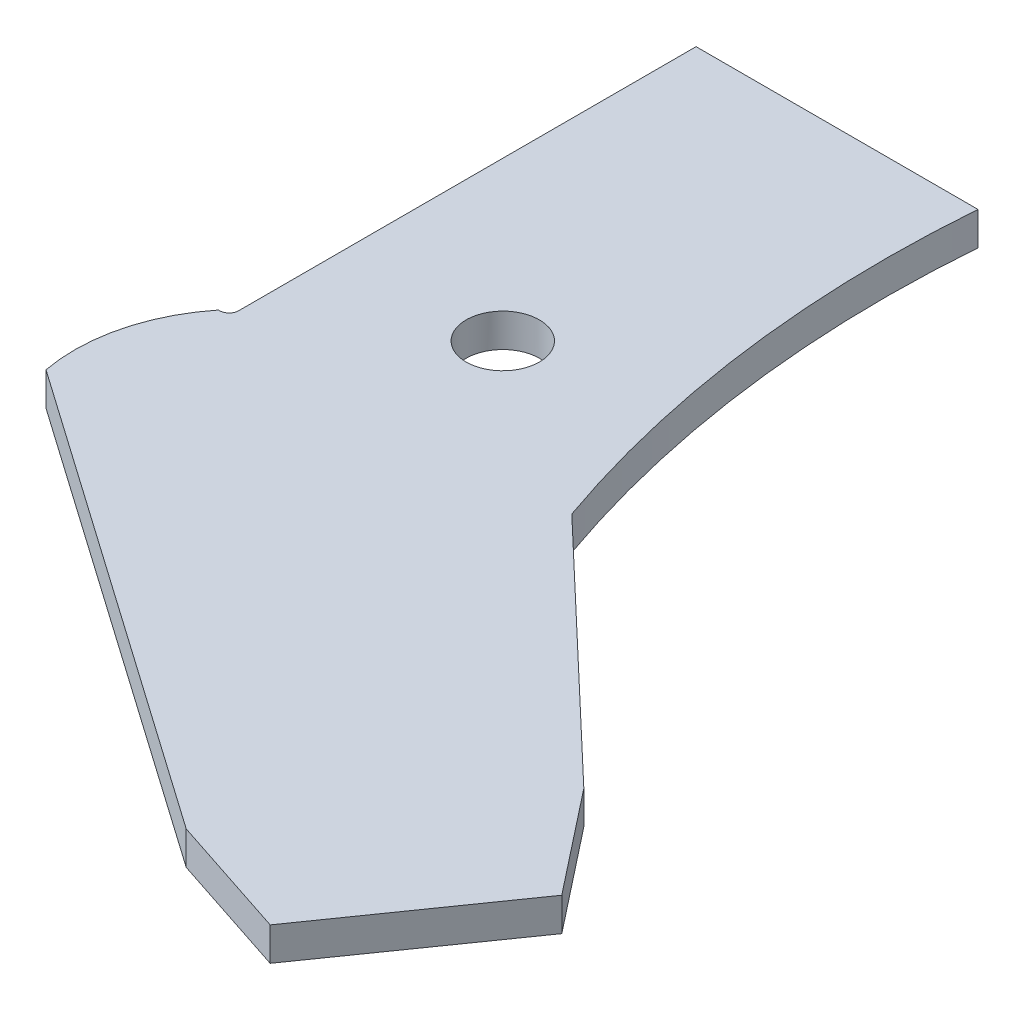
ISO-10303-21;
HEADER;
FILE_DESCRIPTION(('STEP AP214'),'2;1');
FILE_NAME('part.step','',(''),(''),'','','');
FILE_SCHEMA(('AUTOMOTIVE_DESIGN { 1 0 10303 214 1 1 1 1 }'));
ENDSEC;
DATA;
#1=APPLICATION_CONTEXT('core data for automotive mechanical design processes');
#2=APPLICATION_PROTOCOL_DEFINITION('international standard','automotive_design',2000,#1);
#3=PRODUCT_CONTEXT('',#1,'mechanical');
#4=PRODUCT('Part','Part','',(#3));
#5=PRODUCT_RELATED_PRODUCT_CATEGORY('part','',(#4));
#6=PRODUCT_DEFINITION_FORMATION('','',#4);
#7=PRODUCT_DEFINITION_CONTEXT('part definition',#1,'design');
#8=PRODUCT_DEFINITION('design','',#6,#7);
#9=PRODUCT_DEFINITION_SHAPE('','',#8);
#10=(LENGTH_UNIT() NAMED_UNIT(*) SI_UNIT(.MILLI.,.METRE.));
#11=(NAMED_UNIT(*) PLANE_ANGLE_UNIT() SI_UNIT($,.RADIAN.));
#12=(NAMED_UNIT(*) SI_UNIT($,.STERADIAN.) SOLID_ANGLE_UNIT());
#13=UNCERTAINTY_MEASURE_WITH_UNIT(LENGTH_MEASURE(1.E-05),#10,'distance_accuracy_value','');
#14=(GEOMETRIC_REPRESENTATION_CONTEXT(3) GLOBAL_UNCERTAINTY_ASSIGNED_CONTEXT((#13)) GLOBAL_UNIT_ASSIGNED_CONTEXT((#10,
#11,#12)) REPRESENTATION_CONTEXT('',''));
#15=CARTESIAN_POINT('',(0.,0.,0.));
#16=DIRECTION('',(0.,0.,1.));
#17=DIRECTION('',(1.,0.,0.));
#18=AXIS2_PLACEMENT_3D('',#15,#16,#17);
#19=CARTESIAN_POINT('',(-50.2046875,11.1125,152.5984375));
#20=DIRECTION('',(0.,-1.,0.));
#21=DIRECTION('',(0.,0.,-1.));
#22=AXIS2_PLACEMENT_3D('',#19,#20,#21);
#23=PLANE('',#22);
#24=CARTESIAN_POINT('',(5.75468750000002,11.1125,117.2765625));
#25=DIRECTION('',(0.,1.,0.));
#26=DIRECTION('',(0.,0.,1.));
#27=AXIS2_PLACEMENT_3D('',#24,#25,#26);
#28=CIRCLE('',#27,12.20390625);
#29=CARTESIAN_POINT('',(5.75468750000002,11.1125,129.48046875));
#30=VERTEX_POINT('',#29);
#31=EDGE_CURVE('E250',#30,#30,#28,.T.);
#32=ORIENTED_EDGE('',*,*,#31,.F.);
#33=EDGE_LOOP('',(#32));
#34=FACE_BOUND('',#33,.T.);
#35=DIRECTION('',(0.,0.,1.));
#36=VECTOR('',#35,1.);
#37=CARTESIAN_POINT('',(-47.0296875,11.1125,0.));
#38=LINE('',#37,#36);
#39=CARTESIAN_POINT('',(-47.0296875,11.1125,0.));
#40=VERTEX_POINT('',#39);
#41=CARTESIAN_POINT('',(-47.0296875,11.1125,152.5984375));
#42=VERTEX_POINT('',#41);
#43=EDGE_CURVE('E168',#40,#42,#38,.T.);
#44=ORIENTED_EDGE('',*,*,#43,.T.);
#45=CARTESIAN_POINT('',(-50.2046875,11.1125,152.5984375));
#46=DIRECTION('',(0.,-1.,0.));
#47=DIRECTION('',(0.,0.,-1.));
#48=AXIS2_PLACEMENT_3D('',#45,#46,#47);
#49=CIRCLE('',#48,3.17499999999999);
#50=CARTESIAN_POINT('',(-50.2046875,11.1125,155.7734375));
#51=VERTEX_POINT('',#50);
#52=EDGE_CURVE('E102',#42,#51,#49,.T.);
#53=ORIENTED_EDGE('',*,*,#52,.T.);
#54=DIRECTION('',(-1.,0.,0.));
#55=VECTOR('',#54,1.);
#56=CARTESIAN_POINT('',(-50.6015625,11.1125,155.7734375));
#57=LINE('',#56,#55);
#58=CARTESIAN_POINT('',(-50.6015625,11.1125,155.7734375));
#59=VERTEX_POINT('',#58);
#60=EDGE_CURVE('E192',#51,#59,#57,.T.);
#61=ORIENTED_EDGE('',*,*,#60,.T.);
#62=CARTESIAN_POINT('',(-6.35000000000003,11.1125,191.29375));
#63=DIRECTION('',(0.,1.,0.));
#64=DIRECTION('',(0.,0.,-1.));
#65=AXIS2_PLACEMENT_3D('',#62,#63,#64);
#66=CIRCLE('',#65,56.7441043967482);
#67=CARTESIAN_POINT('',(-62.1109375,11.1125,201.8109375));
#68=VERTEX_POINT('',#67);
#69=EDGE_CURVE('E210',#59,#68,#66,.T.);
#70=ORIENTED_EDGE('',*,*,#69,.T.);
#71=DIRECTION('',(0.819152044288994,0.,0.573576436351042));
#72=VECTOR('',#71,1.);
#73=CARTESIAN_POINT('',(-62.1109375,11.1125,201.8109375));
#74=LINE('',#73,#72);
#75=CARTESIAN_POINT('',(93.9375269370535,11.1125,311.077248624874));
#76=VERTEX_POINT('',#75);
#77=EDGE_CURVE('E207',#68,#76,#74,.T.);
#78=ORIENTED_EDGE('',*,*,#77,.T.);
#79=DIRECTION('',(0.949963175276949,0.,0.312361914480201));
#80=VECTOR('',#79,1.);
#81=CARTESIAN_POINT('',(93.9375269370535,11.1125,311.077248624874));
#82=LINE('',#81,#80);
#83=CARTESIAN_POINT('',(135.682650241894,11.1125,324.803661369147));
#84=VERTEX_POINT('',#83);
#85=EDGE_CURVE('E209',#76,#84,#82,.T.);
#86=ORIENTED_EDGE('',*,*,#85,.T.);
#87=DIRECTION('',(0.573576436351061,0.,-0.819152044288981));
#88=VECTOR('',#87,1.);
#89=CARTESIAN_POINT('',(135.682650241894,11.1125,324.803661369147));
#90=LINE('',#89,#88);
#91=CARTESIAN_POINT('',(175.746964321015,11.1125,267.585891075562));
#92=VERTEX_POINT('',#91);
#93=EDGE_CURVE('E212',#84,#92,#90,.T.);
#94=ORIENTED_EDGE('',*,*,#93,.T.);
#95=DIRECTION('',(-0.618430727413905,0.,-0.785839319066124));
#96=VECTOR('',#95,1.);
#97=CARTESIAN_POINT('',(175.746964321015,11.1125,267.585891075562));
#98=LINE('',#97,#96);
#99=CARTESIAN_POINT('',(148.570682499492,11.1125,233.053016406348));
#100=VERTEX_POINT('',#99);
#101=EDGE_CURVE('E129',#92,#100,#98,.T.);
#102=ORIENTED_EDGE('',*,*,#101,.T.);
#103=DIRECTION('',(-0.724802516724885,0.,-0.688956683507224));
#104=VECTOR('',#103,1.);
#105=CARTESIAN_POINT('',(67.2703125,11.1125,155.7734375));
#106=LINE('',#105,#104);
#107=CARTESIAN_POINT('',(67.2703124999999,11.1125,155.7734375));
#108=VERTEX_POINT('',#107);
#109=EDGE_CURVE('E124',#100,#108,#106,.T.);
#110=ORIENTED_EDGE('',*,*,#109,.T.);
#111=CARTESIAN_POINT('',(425.270240042471,11.1125,30.0545346935261));
#112=DIRECTION('',(0.,-1.,0.));
#113=DIRECTION('',(0.,0.,1.));
#114=AXIS2_PLACEMENT_3D('',#111,#112,#113);
#115=CIRCLE('',#114,379.432722156745);
#116=CARTESIAN_POINT('',(47.0296875,11.1125,0.));
#117=VERTEX_POINT('',#116);
#118=EDGE_CURVE('E127',#108,#117,#115,.T.);
#119=ORIENTED_EDGE('',*,*,#118,.T.);
#120=DIRECTION('',(-1.,0.,0.));
#121=VECTOR('',#120,1.);
#122=CARTESIAN_POINT('',(47.0296875,11.1125,0.));
#123=LINE('',#122,#121);
#124=EDGE_CURVE('E50',#117,#40,#123,.T.);
#125=ORIENTED_EDGE('',*,*,#124,.T.);
#126=EDGE_LOOP('',(#44,#53,#61,#70,#78,#86,#94,#102,#110,#119,#125));
#127=FACE_BOUND('',#126,.T.);
#128=ADVANCED_FACE('F33',(#34,#127),#23,.F.);
#129=CARTESIAN_POINT('',(-50.2046875,0.,152.5984375));
#130=DIRECTION('',(0.,-1.,0.));
#131=DIRECTION('',(0.,0.,-1.));
#132=AXIS2_PLACEMENT_3D('',#129,#130,#131);
#133=PLANE('',#132);
#134=CARTESIAN_POINT('',(5.75468750000002,0.,117.2765625));
#135=DIRECTION('',(0.,-1.,0.));
#136=DIRECTION('',(0.,0.,-1.));
#137=AXIS2_PLACEMENT_3D('',#134,#135,#136);
#138=CIRCLE('',#137,12.20390625);
#139=CARTESIAN_POINT('',(5.75468750000002,0.,105.07265625));
#140=VERTEX_POINT('',#139);
#141=EDGE_CURVE('E151',#140,#140,#138,.F.);
#142=ORIENTED_EDGE('',*,*,#141,.T.);
#143=EDGE_LOOP('',(#142));
#144=FACE_BOUND('',#143,.T.);
#145=DIRECTION('',(0.,0.,1.));
#146=VECTOR('',#145,1.);
#147=CARTESIAN_POINT('',(-47.0296875,0.,0.));
#148=LINE('',#147,#146);
#149=CARTESIAN_POINT('',(-47.0296875,0.,0.));
#150=VERTEX_POINT('',#149);
#151=CARTESIAN_POINT('',(-47.0296875,0.,152.5984375));
#152=VERTEX_POINT('',#151);
#153=EDGE_CURVE('E147',#150,#152,#148,.T.);
#154=ORIENTED_EDGE('',*,*,#153,.F.);
#155=DIRECTION('',(-1.,0.,0.));
#156=VECTOR('',#155,1.);
#157=CARTESIAN_POINT('',(47.0296875,0.,0.));
#158=LINE('',#157,#156);
#159=CARTESIAN_POINT('',(47.0296875,0.,0.));
#160=VERTEX_POINT('',#159);
#161=EDGE_CURVE('E94',#160,#150,#158,.T.);
#162=ORIENTED_EDGE('',*,*,#161,.F.);
#163=CARTESIAN_POINT('',(425.270240042471,0.,30.0545346935261));
#164=DIRECTION('',(0.,-1.,0.));
#165=DIRECTION('',(0.,0.,1.));
#166=AXIS2_PLACEMENT_3D('',#163,#164,#165);
#167=CIRCLE('',#166,379.432722156745);
#168=CARTESIAN_POINT('',(67.2703124999999,0.,155.7734375));
#169=VERTEX_POINT('',#168);
#170=EDGE_CURVE('E88',#169,#160,#167,.T.);
#171=ORIENTED_EDGE('',*,*,#170,.F.);
#172=DIRECTION('',(-0.724802516724885,0.,-0.688956683507224));
#173=VECTOR('',#172,1.);
#174=CARTESIAN_POINT('',(67.2703125,0.,155.7734375));
#175=LINE('',#174,#173);
#176=CARTESIAN_POINT('',(148.570682499492,0.,233.053016406348));
#177=VERTEX_POINT('',#176);
#178=EDGE_CURVE('E137',#177,#169,#175,.T.);
#179=ORIENTED_EDGE('',*,*,#178,.F.);
#180=DIRECTION('',(-0.618430727413905,0.,-0.785839319066124));
#181=VECTOR('',#180,1.);
#182=CARTESIAN_POINT('',(175.746964321015,0.,267.585891075562));
#183=LINE('',#182,#181);
#184=CARTESIAN_POINT('',(175.746964321015,0.,267.585891075562));
#185=VERTEX_POINT('',#184);
#186=EDGE_CURVE('E163',#185,#177,#183,.T.);
#187=ORIENTED_EDGE('',*,*,#186,.F.);
#188=DIRECTION('',(0.573576436351061,0.,-0.819152044288981));
#189=VECTOR('',#188,1.);
#190=CARTESIAN_POINT('',(135.682650241894,0.,324.803661369147));
#191=LINE('',#190,#189);
#192=CARTESIAN_POINT('',(135.682650241894,0.,324.803661369147));
#193=VERTEX_POINT('',#192);
#194=EDGE_CURVE('E161',#193,#185,#191,.T.);
#195=ORIENTED_EDGE('',*,*,#194,.F.);
#196=DIRECTION('',(0.949963175276949,0.,0.312361914480201));
#197=VECTOR('',#196,1.);
#198=CARTESIAN_POINT('',(93.9375269370535,0.,311.077248624874));
#199=LINE('',#198,#197);
#200=CARTESIAN_POINT('',(93.9375269370535,0.,311.077248624874));
#201=VERTEX_POINT('',#200);
#202=EDGE_CURVE('E159',#201,#193,#199,.T.);
#203=ORIENTED_EDGE('',*,*,#202,.F.);
#204=DIRECTION('',(0.819152044288994,0.,0.573576436351042));
#205=VECTOR('',#204,1.);
#206=CARTESIAN_POINT('',(-62.1109375,0.,201.8109375));
#207=LINE('',#206,#205);
#208=CARTESIAN_POINT('',(-62.1109375,0.,201.8109375));
#209=VERTEX_POINT('',#208);
#210=EDGE_CURVE('E157',#209,#201,#207,.T.);
#211=ORIENTED_EDGE('',*,*,#210,.F.);
#212=CARTESIAN_POINT('',(-6.35000000000003,0.,191.29375));
#213=DIRECTION('',(0.,1.,0.));
#214=DIRECTION('',(0.,0.,-1.));
#215=AXIS2_PLACEMENT_3D('',#212,#213,#214);
#216=CIRCLE('',#215,56.7441043967482);
#217=CARTESIAN_POINT('',(-50.6015625,0.,155.7734375));
#218=VERTEX_POINT('',#217);
#219=EDGE_CURVE('E155',#218,#209,#216,.T.);
#220=ORIENTED_EDGE('',*,*,#219,.F.);
#221=DIRECTION('',(-1.,0.,0.));
#222=VECTOR('',#221,1.);
#223=CARTESIAN_POINT('',(-50.6015625,0.,155.7734375));
#224=LINE('',#223,#222);
#225=CARTESIAN_POINT('',(-50.2046875,0.,155.7734375));
#226=VERTEX_POINT('',#225);
#227=EDGE_CURVE('E153',#226,#218,#224,.T.);
#228=ORIENTED_EDGE('',*,*,#227,.F.);
#229=CARTESIAN_POINT('',(-50.2046875,0.,152.5984375));
#230=DIRECTION('',(0.,-1.,0.));
#231=DIRECTION('',(0.,0.,-1.));
#232=AXIS2_PLACEMENT_3D('',#229,#230,#231);
#233=CIRCLE('',#232,3.17499999999999);
#234=EDGE_CURVE('E150',#152,#226,#233,.T.);
#235=ORIENTED_EDGE('',*,*,#234,.F.);
#236=EDGE_LOOP('',(#154,#162,#171,#179,#187,#195,#203,#211,#220,#228,#235));
#237=FACE_BOUND('',#236,.T.);
#238=ADVANCED_FACE('F196',(#144,#237),#133,.T.);
#239=CARTESIAN_POINT('',(-47.0296875,11.1125,0.));
#240=DIRECTION('',(1.,0.,0.));
#241=DIRECTION('',(0.,0.,-1.));
#242=AXIS2_PLACEMENT_3D('',#239,#240,#241);
#243=PLANE('',#242);
#244=ORIENTED_EDGE('',*,*,#153,.T.);
#245=DIRECTION('',(0.,-1.,0.));
#246=VECTOR('',#245,1.);
#247=CARTESIAN_POINT('',(-47.0296875,11.1125,152.5984375));
#248=LINE('',#247,#246);
#249=EDGE_CURVE('E11',#42,#152,#248,.T.);
#250=ORIENTED_EDGE('',*,*,#249,.F.);
#251=ORIENTED_EDGE('',*,*,#43,.F.);
#252=DIRECTION('',(0.,-1.,0.));
#253=VECTOR('',#252,1.);
#254=CARTESIAN_POINT('',(-47.0296875,11.1125,0.));
#255=LINE('',#254,#253);
#256=EDGE_CURVE('E143',#40,#150,#255,.T.);
#257=ORIENTED_EDGE('',*,*,#256,.T.);
#258=EDGE_LOOP('',(#244,#250,#251,#257));
#259=FACE_BOUND('',#258,.T.);
#260=ADVANCED_FACE('F35',(#259),#243,.F.);
#261=CARTESIAN_POINT('',(-50.2046875,11.1125,152.5984375));
#262=DIRECTION('',(0.,-1.,0.));
#263=DIRECTION('',(0.,0.,-1.));
#264=AXIS2_PLACEMENT_3D('',#261,#262,#263);
#265=CYLINDRICAL_SURFACE('',#264,3.17499999999999);
#266=ORIENTED_EDGE('',*,*,#234,.T.);
#267=DIRECTION('',(0.,-1.,0.));
#268=VECTOR('',#267,1.);
#269=CARTESIAN_POINT('',(-50.2046875,11.1125,155.7734375));
#270=LINE('',#269,#268);
#271=EDGE_CURVE('E42',#51,#226,#270,.T.);
#272=ORIENTED_EDGE('',*,*,#271,.F.);
#273=ORIENTED_EDGE('',*,*,#52,.F.);
#274=ORIENTED_EDGE('',*,*,#249,.T.);
#275=EDGE_LOOP('',(#266,#272,#273,#274));
#276=FACE_BOUND('',#275,.T.);
#277=ADVANCED_FACE('F261',(#276),#265,.F.);
#278=CARTESIAN_POINT('',(-50.6015625,11.1125,155.7734375));
#279=DIRECTION('',(0.,0.,1.));
#280=DIRECTION('',(1.,0.,0.));
#281=AXIS2_PLACEMENT_3D('',#278,#279,#280);
#282=PLANE('',#281);
#283=ORIENTED_EDGE('',*,*,#227,.T.);
#284=DIRECTION('',(0.,-1.,0.));
#285=VECTOR('',#284,1.);
#286=CARTESIAN_POINT('',(-50.6015625,11.1125,155.7734375));
#287=LINE('',#286,#285);
#288=EDGE_CURVE('E184',#59,#218,#287,.T.);
#289=ORIENTED_EDGE('',*,*,#288,.F.);
#290=ORIENTED_EDGE('',*,*,#60,.F.);
#291=ORIENTED_EDGE('',*,*,#271,.T.);
#292=EDGE_LOOP('',(#283,#289,#290,#291));
#293=FACE_BOUND('',#292,.T.);
#294=ADVANCED_FACE('F190',(#293),#282,.F.);
#295=CARTESIAN_POINT('',(-6.35000000000003,11.1125,191.29375));
#296=DIRECTION('',(0.,-1.,0.));
#297=DIRECTION('',(0.,0.,-1.));
#298=AXIS2_PLACEMENT_3D('',#295,#296,#297);
#299=CYLINDRICAL_SURFACE('',#298,56.7441043967482);
#300=ORIENTED_EDGE('',*,*,#219,.T.);
#301=DIRECTION('',(0.,-1.,0.));
#302=VECTOR('',#301,1.);
#303=CARTESIAN_POINT('',(-62.1109375,11.1125,201.8109375));
#304=LINE('',#303,#302);
#305=EDGE_CURVE('E181',#68,#209,#304,.T.);
#306=ORIENTED_EDGE('',*,*,#305,.F.);
#307=ORIENTED_EDGE('',*,*,#69,.F.);
#308=ORIENTED_EDGE('',*,*,#288,.T.);
#309=EDGE_LOOP('',(#300,#306,#307,#308));
#310=FACE_BOUND('',#309,.T.);
#311=ADVANCED_FACE('F201',(#310),#299,.T.);
#312=CARTESIAN_POINT('',(-62.1109375,11.1125,201.8109375));
#313=DIRECTION('',(0.573576436351042,0.,-0.819152044288994));
#314=DIRECTION('',(-0.819152044288994,0.,-0.573576436351042));
#315=AXIS2_PLACEMENT_3D('',#312,#313,#314);
#316=PLANE('',#315);
#317=ORIENTED_EDGE('',*,*,#210,.T.);
#318=DIRECTION('',(0.,-1.,0.));
#319=VECTOR('',#318,1.);
#320=CARTESIAN_POINT('',(93.9375269370535,11.1125,311.077248624874));
#321=LINE('',#320,#319);
#322=EDGE_CURVE('E178',#76,#201,#321,.T.);
#323=ORIENTED_EDGE('',*,*,#322,.F.);
#324=ORIENTED_EDGE('',*,*,#77,.F.);
#325=ORIENTED_EDGE('',*,*,#305,.T.);
#326=EDGE_LOOP('',(#317,#323,#324,#325));
#327=FACE_BOUND('',#326,.T.);
#328=ADVANCED_FACE('F205',(#327),#316,.F.);
#329=CARTESIAN_POINT('',(93.9375269370535,11.1125,311.077248624874));
#330=DIRECTION('',(0.3123619144802,0.,-0.949963175276949));
#331=DIRECTION('',(-0.949963175276949,0.,-0.3123619144802));
#332=AXIS2_PLACEMENT_3D('',#329,#330,#331);
#333=PLANE('',#332);
#334=ORIENTED_EDGE('',*,*,#202,.T.);
#335=DIRECTION('',(0.,-1.,0.));
#336=VECTOR('',#335,1.);
#337=CARTESIAN_POINT('',(135.682650241894,11.1125,324.803661369147));
#338=LINE('',#337,#336);
#339=EDGE_CURVE('E175',#84,#193,#338,.T.);
#340=ORIENTED_EDGE('',*,*,#339,.F.);
#341=ORIENTED_EDGE('',*,*,#85,.F.);
#342=ORIENTED_EDGE('',*,*,#322,.T.);
#343=EDGE_LOOP('',(#334,#340,#341,#342));
#344=FACE_BOUND('',#343,.T.);
#345=ADVANCED_FACE('F274',(#344),#333,.F.);
#346=CARTESIAN_POINT('',(135.682650241894,11.1125,324.803661369147));
#347=DIRECTION('',(-0.819152044288981,0.,-0.573576436351061));
#348=DIRECTION('',(-0.573576436351061,0.,0.819152044288981));
#349=AXIS2_PLACEMENT_3D('',#346,#347,#348);
#350=PLANE('',#349);
#351=ORIENTED_EDGE('',*,*,#194,.T.);
#352=DIRECTION('',(0.,-1.,0.));
#353=VECTOR('',#352,1.);
#354=CARTESIAN_POINT('',(175.746964321015,11.1125,267.585891075562));
#355=LINE('',#354,#353);
#356=EDGE_CURVE('E172',#92,#185,#355,.T.);
#357=ORIENTED_EDGE('',*,*,#356,.F.);
#358=ORIENTED_EDGE('',*,*,#93,.F.);
#359=ORIENTED_EDGE('',*,*,#339,.T.);
#360=EDGE_LOOP('',(#351,#357,#358,#359));
#361=FACE_BOUND('',#360,.T.);
#362=ADVANCED_FACE('F221',(#361),#350,.F.);
#363=CARTESIAN_POINT('',(175.746964321015,11.1125,267.585891075562));
#364=DIRECTION('',(-0.785839319066124,0.,0.618430727413905));
#365=DIRECTION('',(0.618430727413905,0.,0.785839319066124));
#366=AXIS2_PLACEMENT_3D('',#363,#364,#365);
#367=PLANE('',#366);
#368=ORIENTED_EDGE('',*,*,#186,.T.);
#369=DIRECTION('',(0.,-1.,0.));
#370=VECTOR('',#369,1.);
#371=CARTESIAN_POINT('',(148.570682499492,11.1125,233.053016406348));
#372=LINE('',#371,#370);
#373=EDGE_CURVE('E138',#100,#177,#372,.T.);
#374=ORIENTED_EDGE('',*,*,#373,.F.);
#375=ORIENTED_EDGE('',*,*,#101,.F.);
#376=ORIENTED_EDGE('',*,*,#356,.T.);
#377=EDGE_LOOP('',(#368,#374,#375,#376));
#378=FACE_BOUND('',#377,.T.);
#379=ADVANCED_FACE('F225',(#378),#367,.F.);
#380=CARTESIAN_POINT('',(67.2703125,11.1125,155.7734375));
#381=DIRECTION('',(-0.688956683507224,0.,0.724802516724884));
#382=DIRECTION('',(0.724802516724884,0.,0.688956683507224));
#383=AXIS2_PLACEMENT_3D('',#380,#381,#382);
#384=PLANE('',#383);
#385=ORIENTED_EDGE('',*,*,#178,.T.);
#386=DIRECTION('',(0.,-1.,0.));
#387=VECTOR('',#386,1.);
#388=CARTESIAN_POINT('',(67.2703124999999,11.1125,155.7734375));
#389=LINE('',#388,#387);
#390=EDGE_CURVE('E134',#108,#169,#389,.T.);
#391=ORIENTED_EDGE('',*,*,#390,.F.);
#392=ORIENTED_EDGE('',*,*,#109,.F.);
#393=ORIENTED_EDGE('',*,*,#373,.T.);
#394=EDGE_LOOP('',(#385,#391,#392,#393));
#395=FACE_BOUND('',#394,.T.);
#396=ADVANCED_FACE('F135',(#395),#384,.F.);
#397=CARTESIAN_POINT('',(425.270240042471,11.1125,30.0545346935261));
#398=DIRECTION('',(0.,-1.,0.));
#399=DIRECTION('',(0.,0.,-1.));
#400=AXIS2_PLACEMENT_3D('',#397,#398,#399);
#401=CYLINDRICAL_SURFACE('',#400,379.432722156745);
#402=ORIENTED_EDGE('',*,*,#170,.T.);
#403=DIRECTION('',(0.,-1.,0.));
#404=VECTOR('',#403,1.);
#405=CARTESIAN_POINT('',(47.0296875,11.1125,0.));
#406=LINE('',#405,#404);
#407=EDGE_CURVE('E139',#117,#160,#406,.T.);
#408=ORIENTED_EDGE('',*,*,#407,.F.);
#409=ORIENTED_EDGE('',*,*,#118,.F.);
#410=ORIENTED_EDGE('',*,*,#390,.T.);
#411=EDGE_LOOP('',(#402,#408,#409,#410));
#412=FACE_BOUND('',#411,.T.);
#413=ADVANCED_FACE('F141',(#412),#401,.F.);
#414=CARTESIAN_POINT('',(47.0296875,11.1125,0.));
#415=DIRECTION('',(0.,0.,1.));
#416=DIRECTION('',(1.,0.,0.));
#417=AXIS2_PLACEMENT_3D('',#414,#415,#416);
#418=PLANE('',#417);
#419=ORIENTED_EDGE('',*,*,#161,.T.);
#420=ORIENTED_EDGE('',*,*,#256,.F.);
#421=ORIENTED_EDGE('',*,*,#124,.F.);
#422=ORIENTED_EDGE('',*,*,#407,.T.);
#423=EDGE_LOOP('',(#419,#420,#421,#422));
#424=FACE_BOUND('',#423,.T.);
#425=ADVANCED_FACE('F229',(#424),#418,.F.);
#426=CARTESIAN_POINT('',(5.75468750000002,-34.5178594653596,117.2765625));
#427=DIRECTION('',(0.,1.,0.));
#428=DIRECTION('',(0.,0.,1.));
#429=AXIS2_PLACEMENT_3D('',#426,#427,#428);
#430=CYLINDRICAL_SURFACE('',#429,12.20390625);
#431=ORIENTED_EDGE('',*,*,#31,.T.);
#432=EDGE_LOOP('',(#431));
#433=FACE_BOUND('',#432,.T.);
#434=ORIENTED_EDGE('',*,*,#141,.F.);
#435=EDGE_LOOP('',(#434));
#436=FACE_BOUND('',#435,.T.);
#437=ADVANCED_FACE('F231',(#433,#436),#430,.F.);
#438=CLOSED_SHELL('',(#128,#238,#260,#277,#294,#311,#328,#345,#362,#379,#396,#413,#425,#437));
#439=MANIFOLD_SOLID_BREP('B2',#438);
#440=ADVANCED_BREP_SHAPE_REPRESENTATION('',(#18,#439),#14);
#441=SHAPE_DEFINITION_REPRESENTATION(#9,#440);
ENDSEC;
END-ISO-10303-21;
